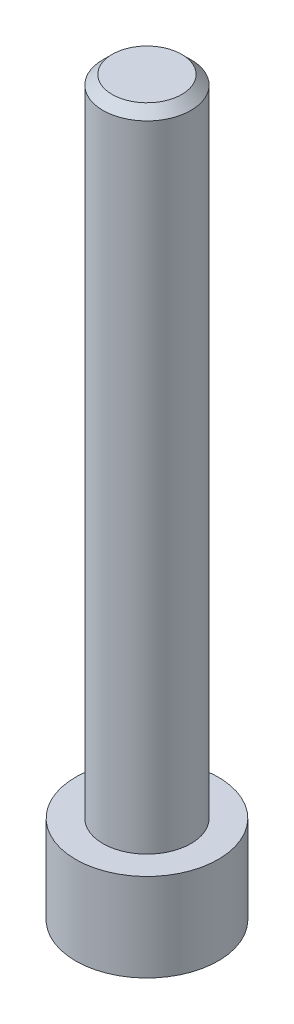
ISO-10303-21;
HEADER;
FILE_DESCRIPTION(('STEP AP214'),'2;1');
FILE_NAME('part.step','',(''),(''),'','','');
FILE_SCHEMA(('AUTOMOTIVE_DESIGN { 1 0 10303 214 1 1 1 1 }'));
ENDSEC;
DATA;
#1=APPLICATION_CONTEXT('core data for automotive mechanical design processes');
#2=APPLICATION_PROTOCOL_DEFINITION('international standard','automotive_design',2000,#1);
#3=PRODUCT_CONTEXT('',#1,'mechanical');
#4=PRODUCT('Part','Part','',(#3));
#5=PRODUCT_RELATED_PRODUCT_CATEGORY('part','',(#4));
#6=PRODUCT_DEFINITION_FORMATION('','',#4);
#7=PRODUCT_DEFINITION_CONTEXT('part definition',#1,'design');
#8=PRODUCT_DEFINITION('design','',#6,#7);
#9=PRODUCT_DEFINITION_SHAPE('','',#8);
#10=(LENGTH_UNIT() NAMED_UNIT(*) SI_UNIT(.MILLI.,.METRE.));
#11=(NAMED_UNIT(*) PLANE_ANGLE_UNIT() SI_UNIT($,.RADIAN.));
#12=(NAMED_UNIT(*) SI_UNIT($,.STERADIAN.) SOLID_ANGLE_UNIT());
#13=UNCERTAINTY_MEASURE_WITH_UNIT(LENGTH_MEASURE(1.E-05),#10,'distance_accuracy_value','');
#14=(GEOMETRIC_REPRESENTATION_CONTEXT(3) GLOBAL_UNCERTAINTY_ASSIGNED_CONTEXT((#13)) GLOBAL_UNIT_ASSIGNED_CONTEXT((#10,
#11,#12)) REPRESENTATION_CONTEXT('',''));
#15=CARTESIAN_POINT('',(0.,0.,0.));
#16=DIRECTION('',(0.,0.,1.));
#17=DIRECTION('',(1.,0.,0.));
#18=AXIS2_PLACEMENT_3D('',#15,#16,#17);
#19=CARTESIAN_POINT('',(0.,39.78,0.));
#20=DIRECTION('',(0.,-1.,0.));
#21=DIRECTION('',(0.,0.,-1.));
#22=AXIS2_PLACEMENT_3D('',#19,#20,#21);
#23=CYLINDRICAL_SURFACE('',#22,3.875);
#24=CARTESIAN_POINT('',(0.,0.,0.));
#25=DIRECTION('',(0.,1.,0.));
#26=DIRECTION('',(0.,0.,1.));
#27=AXIS2_PLACEMENT_3D('',#24,#25,#26);
#28=CIRCLE('',#27,3.875);
#29=CARTESIAN_POINT('',(0.,0.,3.875));
#30=VERTEX_POINT('',#29);
#31=EDGE_CURVE('E151',#30,#30,#28,.T.);
#32=ORIENTED_EDGE('',*,*,#31,.T.);
#33=EDGE_LOOP('',(#32));
#34=FACE_BOUND('',#33,.T.);
#35=CARTESIAN_POINT('',(0.,4.78,0.));
#36=DIRECTION('',(0.,1.,0.));
#37=DIRECTION('',(0.,0.,1.));
#38=AXIS2_PLACEMENT_3D('',#35,#36,#37);
#39=CIRCLE('',#38,3.875);
#40=CARTESIAN_POINT('',(0.,4.78,3.875));
#41=VERTEX_POINT('',#40);
#42=EDGE_CURVE('E150',#41,#41,#39,.T.);
#43=ORIENTED_EDGE('',*,*,#42,.F.);
#44=EDGE_LOOP('',(#43));
#45=FACE_BOUND('',#44,.T.);
#46=ADVANCED_FACE('F40',(#34,#45),#23,.T.);
#47=CARTESIAN_POINT('',(0.,0.,0.));
#48=DIRECTION('',(0.,1.,0.));
#49=DIRECTION('',(0.,0.,1.));
#50=AXIS2_PLACEMENT_3D('',#47,#48,#49);
#51=PLANE('',#50);
#52=DIRECTION('',(-0.5,0.,0.866025403784439));
#53=VECTOR('',#52,1.);
#54=CARTESIAN_POINT('',(2.64426423288849,0.,0.));
#55=LINE('',#54,#53);
#56=CARTESIAN_POINT('',(2.64426423288849,0.,0.));
#57=VERTEX_POINT('',#56);
#58=CARTESIAN_POINT('',(1.32213211644424,0.,2.29));
#59=VERTEX_POINT('',#58);
#60=EDGE_CURVE('E129',#57,#59,#55,.T.);
#61=ORIENTED_EDGE('',*,*,#60,.F.);
#62=DIRECTION('',(0.5,0.,0.866025403784439));
#63=VECTOR('',#62,1.);
#64=CARTESIAN_POINT('',(1.32213211644424,0.,-2.29));
#65=LINE('',#64,#63);
#66=CARTESIAN_POINT('',(1.32213211644424,0.,-2.29));
#67=VERTEX_POINT('',#66);
#68=EDGE_CURVE('E55',#67,#57,#65,.T.);
#69=ORIENTED_EDGE('',*,*,#68,.F.);
#70=DIRECTION('',(1.,0.,0.));
#71=VECTOR('',#70,1.);
#72=CARTESIAN_POINT('',(-1.32213211644424,0.,-2.29));
#73=LINE('',#72,#71);
#74=CARTESIAN_POINT('',(-1.32213211644424,0.,-2.29));
#75=VERTEX_POINT('',#74);
#76=EDGE_CURVE('E138',#75,#67,#73,.T.);
#77=ORIENTED_EDGE('',*,*,#76,.F.);
#78=DIRECTION('',(0.5,0.,-0.866025403784439));
#79=VECTOR('',#78,1.);
#80=CARTESIAN_POINT('',(-2.64426423288849,0.,0.));
#81=LINE('',#80,#79);
#82=CARTESIAN_POINT('',(-2.64426423288849,0.,0.));
#83=VERTEX_POINT('',#82);
#84=EDGE_CURVE('E136',#83,#75,#81,.T.);
#85=ORIENTED_EDGE('',*,*,#84,.F.);
#86=DIRECTION('',(-0.5,0.,-0.866025403784439));
#87=VECTOR('',#86,1.);
#88=CARTESIAN_POINT('',(-1.32213211644424,0.,2.29));
#89=LINE('',#88,#87);
#90=CARTESIAN_POINT('',(-1.32213211644424,0.,2.29));
#91=VERTEX_POINT('',#90);
#92=EDGE_CURVE('E103',#91,#83,#89,.T.);
#93=ORIENTED_EDGE('',*,*,#92,.F.);
#94=DIRECTION('',(-1.,0.,0.));
#95=VECTOR('',#94,1.);
#96=CARTESIAN_POINT('',(1.32213211644424,0.,2.29));
#97=LINE('',#96,#95);
#98=EDGE_CURVE('E132',#59,#91,#97,.T.);
#99=ORIENTED_EDGE('',*,*,#98,.F.);
#100=EDGE_LOOP('',(#61,#69,#77,#85,#93,#99));
#101=FACE_BOUND('',#100,.T.);
#102=ORIENTED_EDGE('',*,*,#31,.F.);
#103=EDGE_LOOP('',(#102));
#104=FACE_BOUND('',#103,.T.);
#105=ADVANCED_FACE('F173',(#101,#104),#51,.F.);
#106=CARTESIAN_POINT('',(0.,4.78,0.));
#107=DIRECTION('',(0.,1.,0.));
#108=DIRECTION('',(0.,0.,1.));
#109=AXIS2_PLACEMENT_3D('',#106,#107,#108);
#110=PLANE('',#109);
#111=CARTESIAN_POINT('',(0.,4.78,0.));
#112=DIRECTION('',(0.,1.,0.));
#113=DIRECTION('',(0.,0.,1.));
#114=AXIS2_PLACEMENT_3D('',#111,#112,#113);
#115=CIRCLE('',#114,2.39);
#116=CARTESIAN_POINT('',(0.,4.78,2.39));
#117=VERTEX_POINT('',#116);
#118=EDGE_CURVE('E142',#117,#117,#115,.T.);
#119=ORIENTED_EDGE('',*,*,#118,.F.);
#120=EDGE_LOOP('',(#119));
#121=FACE_BOUND('',#120,.T.);
#122=ORIENTED_EDGE('',*,*,#42,.T.);
#123=EDGE_LOOP('',(#122));
#124=FACE_BOUND('',#123,.T.);
#125=ADVANCED_FACE('F178',(#121,#124),#110,.T.);
#126=CARTESIAN_POINT('',(0.,4.78,0.));
#127=DIRECTION('',(0.,1.,0.));
#128=DIRECTION('',(0.,0.,1.));
#129=AXIS2_PLACEMENT_3D('',#126,#127,#128);
#130=CYLINDRICAL_SURFACE('',#129,2.39);
#131=CARTESIAN_POINT('',(0.,39.28,0.));
#132=DIRECTION('',(0.,1.,0.));
#133=DIRECTION('',(0.,0.,1.));
#134=AXIS2_PLACEMENT_3D('',#131,#132,#133);
#135=CIRCLE('',#134,2.39);
#136=CARTESIAN_POINT('',(0.,39.28,2.39));
#137=VERTEX_POINT('',#136);
#138=EDGE_CURVE('E12',#137,#137,#135,.F.);
#139=ORIENTED_EDGE('',*,*,#138,.T.);
#140=EDGE_LOOP('',(#139));
#141=FACE_BOUND('',#140,.T.);
#142=ORIENTED_EDGE('',*,*,#118,.T.);
#143=EDGE_LOOP('',(#142));
#144=FACE_BOUND('',#143,.T.);
#145=ADVANCED_FACE('F169',(#141,#144),#130,.T.);
#146=CARTESIAN_POINT('',(0.,39.78,0.));
#147=DIRECTION('',(0.,1.,0.));
#148=DIRECTION('',(0.,0.,1.));
#149=AXIS2_PLACEMENT_3D('',#146,#147,#148);
#150=PLANE('',#149);
#151=CARTESIAN_POINT('',(0.,39.78,0.));
#152=DIRECTION('',(0.,1.,0.));
#153=DIRECTION('',(0.,0.,1.));
#154=AXIS2_PLACEMENT_3D('',#151,#152,#153);
#155=CIRCLE('',#154,1.89);
#156=CARTESIAN_POINT('',(0.,39.78,1.89));
#157=VERTEX_POINT('',#156);
#158=EDGE_CURVE('E48',#157,#157,#155,.T.);
#159=ORIENTED_EDGE('',*,*,#158,.T.);
#160=EDGE_LOOP('',(#159));
#161=FACE_BOUND('',#160,.T.);
#162=ADVANCED_FACE('F158',(#161),#150,.T.);
#163=CARTESIAN_POINT('',(0.,39.78,0.));
#164=DIRECTION('',(0.,-1.,0.));
#165=DIRECTION('',(0.,0.,-1.));
#166=AXIS2_PLACEMENT_3D('',#163,#164,#165);
#167=CONICAL_SURFACE('',#166,1.89,0.785398163397452);
#168=ORIENTED_EDGE('',*,*,#138,.F.);
#169=EDGE_LOOP('',(#168));
#170=FACE_BOUND('',#169,.T.);
#171=ORIENTED_EDGE('',*,*,#158,.F.);
#172=EDGE_LOOP('',(#171));
#173=FACE_BOUND('',#172,.T.);
#174=ADVANCED_FACE('F42',(#170,#173),#167,.T.);
#175=CARTESIAN_POINT('',(1.32213211644424,3.36,-2.29));
#176=DIRECTION('',(0.866025403784439,0.,-0.5));
#177=DIRECTION('',(-0.5,0.,-0.866025403784439));
#178=AXIS2_PLACEMENT_3D('',#175,#176,#177);
#179=PLANE('',#178);
#180=ORIENTED_EDGE('',*,*,#68,.T.);
#181=DIRECTION('',(0.,-1.,0.));
#182=VECTOR('',#181,1.);
#183=CARTESIAN_POINT('',(2.64426423288849,3.36,0.));
#184=LINE('',#183,#182);
#185=CARTESIAN_POINT('',(2.64426423288849,3.36,0.));
#186=VERTEX_POINT('',#185);
#187=EDGE_CURVE('E85',#186,#57,#184,.T.);
#188=ORIENTED_EDGE('',*,*,#187,.F.);
#189=DIRECTION('',(0.5,0.,0.866025403784439));
#190=VECTOR('',#189,1.);
#191=CARTESIAN_POINT('',(1.32213211644424,3.36,-2.29));
#192=LINE('',#191,#190);
#193=CARTESIAN_POINT('',(1.32213211644424,3.36,-2.29));
#194=VERTEX_POINT('',#193);
#195=EDGE_CURVE('E140',#194,#186,#192,.T.);
#196=ORIENTED_EDGE('',*,*,#195,.F.);
#197=DIRECTION('',(0.,-1.,0.));
#198=VECTOR('',#197,1.);
#199=CARTESIAN_POINT('',(1.32213211644424,3.36,-2.29));
#200=LINE('',#199,#198);
#201=EDGE_CURVE('E63',#194,#67,#200,.T.);
#202=ORIENTED_EDGE('',*,*,#201,.T.);
#203=EDGE_LOOP('',(#180,#188,#196,#202));
#204=FACE_BOUND('',#203,.T.);
#205=ADVANCED_FACE('F161',(#204),#179,.F.);
#206=CARTESIAN_POINT('',(-1.32213211644424,3.36,-2.29));
#207=DIRECTION('',(0.,0.,-1.));
#208=DIRECTION('',(-1.,0.,0.));
#209=AXIS2_PLACEMENT_3D('',#206,#207,#208);
#210=PLANE('',#209);
#211=ORIENTED_EDGE('',*,*,#76,.T.);
#212=ORIENTED_EDGE('',*,*,#201,.F.);
#213=DIRECTION('',(1.,0.,0.));
#214=VECTOR('',#213,1.);
#215=CARTESIAN_POINT('',(-1.32213211644424,3.36,-2.29));
#216=LINE('',#215,#214);
#217=CARTESIAN_POINT('',(-1.32213211644424,3.36,-2.29));
#218=VERTEX_POINT('',#217);
#219=EDGE_CURVE('E115',#218,#194,#216,.T.);
#220=ORIENTED_EDGE('',*,*,#219,.F.);
#221=DIRECTION('',(0.,-1.,0.));
#222=VECTOR('',#221,1.);
#223=CARTESIAN_POINT('',(-1.32213211644424,3.36,-2.29));
#224=LINE('',#223,#222);
#225=EDGE_CURVE('E107',#218,#75,#224,.T.);
#226=ORIENTED_EDGE('',*,*,#225,.T.);
#227=EDGE_LOOP('',(#211,#212,#220,#226));
#228=FACE_BOUND('',#227,.T.);
#229=ADVANCED_FACE('F167',(#228),#210,.F.);
#230=CARTESIAN_POINT('',(-2.64426423288849,3.36,0.));
#231=DIRECTION('',(-0.866025403784438,0.,-0.5));
#232=DIRECTION('',(-0.5,0.,0.866025403784439));
#233=AXIS2_PLACEMENT_3D('',#230,#231,#232);
#234=PLANE('',#233);
#235=ORIENTED_EDGE('',*,*,#84,.T.);
#236=ORIENTED_EDGE('',*,*,#225,.F.);
#237=DIRECTION('',(0.5,0.,-0.866025403784439));
#238=VECTOR('',#237,1.);
#239=CARTESIAN_POINT('',(-2.64426423288849,3.36,0.));
#240=LINE('',#239,#238);
#241=CARTESIAN_POINT('',(-2.64426423288849,3.36,0.));
#242=VERTEX_POINT('',#241);
#243=EDGE_CURVE('E111',#242,#218,#240,.T.);
#244=ORIENTED_EDGE('',*,*,#243,.F.);
#245=DIRECTION('',(0.,-1.,0.));
#246=VECTOR('',#245,1.);
#247=CARTESIAN_POINT('',(-2.64426423288849,3.36,0.));
#248=LINE('',#247,#246);
#249=EDGE_CURVE('E96',#242,#83,#248,.T.);
#250=ORIENTED_EDGE('',*,*,#249,.T.);
#251=EDGE_LOOP('',(#235,#236,#244,#250));
#252=FACE_BOUND('',#251,.T.);
#253=ADVANCED_FACE('F112',(#252),#234,.F.);
#254=CARTESIAN_POINT('',(-1.32213211644424,3.36,2.29));
#255=DIRECTION('',(-0.866025403784439,0.,0.5));
#256=DIRECTION('',(0.5,0.,0.866025403784439));
#257=AXIS2_PLACEMENT_3D('',#254,#255,#256);
#258=PLANE('',#257);
#259=ORIENTED_EDGE('',*,*,#92,.T.);
#260=ORIENTED_EDGE('',*,*,#249,.F.);
#261=DIRECTION('',(-0.5,0.,-0.866025403784439));
#262=VECTOR('',#261,1.);
#263=CARTESIAN_POINT('',(-1.32213211644424,3.36,2.29));
#264=LINE('',#263,#262);
#265=CARTESIAN_POINT('',(-1.32213211644424,3.36,2.29));
#266=VERTEX_POINT('',#265);
#267=EDGE_CURVE('E100',#266,#242,#264,.T.);
#268=ORIENTED_EDGE('',*,*,#267,.F.);
#269=DIRECTION('',(0.,-1.,0.));
#270=VECTOR('',#269,1.);
#271=CARTESIAN_POINT('',(-1.32213211644424,3.36,2.29));
#272=LINE('',#271,#270);
#273=EDGE_CURVE('E108',#266,#91,#272,.T.);
#274=ORIENTED_EDGE('',*,*,#273,.T.);
#275=EDGE_LOOP('',(#259,#260,#268,#274));
#276=FACE_BOUND('',#275,.T.);
#277=ADVANCED_FACE('F98',(#276),#258,.F.);
#278=CARTESIAN_POINT('',(1.32213211644424,3.36,2.29));
#279=DIRECTION('',(0.,0.,1.));
#280=DIRECTION('',(1.,0.,0.));
#281=AXIS2_PLACEMENT_3D('',#278,#279,#280);
#282=PLANE('',#281);
#283=ORIENTED_EDGE('',*,*,#98,.T.);
#284=ORIENTED_EDGE('',*,*,#273,.F.);
#285=DIRECTION('',(-1.,0.,0.));
#286=VECTOR('',#285,1.);
#287=CARTESIAN_POINT('',(1.32213211644424,3.36,2.29));
#288=LINE('',#287,#286);
#289=CARTESIAN_POINT('',(1.32213211644424,3.36,2.29));
#290=VERTEX_POINT('',#289);
#291=EDGE_CURVE('E121',#290,#266,#288,.T.);
#292=ORIENTED_EDGE('',*,*,#291,.F.);
#293=DIRECTION('',(0.,-1.,0.));
#294=VECTOR('',#293,1.);
#295=CARTESIAN_POINT('',(1.32213211644424,3.36,2.29));
#296=LINE('',#295,#294);
#297=EDGE_CURVE('E145',#290,#59,#296,.T.);
#298=ORIENTED_EDGE('',*,*,#297,.T.);
#299=EDGE_LOOP('',(#283,#284,#292,#298));
#300=FACE_BOUND('',#299,.T.);
#301=ADVANCED_FACE('F192',(#300),#282,.F.);
#302=CARTESIAN_POINT('',(2.64426423288849,3.36,0.));
#303=DIRECTION('',(0.866025403784439,0.,0.5));
#304=DIRECTION('',(0.5,0.,-0.866025403784439));
#305=AXIS2_PLACEMENT_3D('',#302,#303,#304);
#306=PLANE('',#305);
#307=ORIENTED_EDGE('',*,*,#60,.T.);
#308=ORIENTED_EDGE('',*,*,#297,.F.);
#309=DIRECTION('',(-0.5,0.,0.866025403784439));
#310=VECTOR('',#309,1.);
#311=CARTESIAN_POINT('',(2.64426423288849,3.36,0.));
#312=LINE('',#311,#310);
#313=EDGE_CURVE('E123',#186,#290,#312,.T.);
#314=ORIENTED_EDGE('',*,*,#313,.F.);
#315=ORIENTED_EDGE('',*,*,#187,.T.);
#316=EDGE_LOOP('',(#307,#308,#314,#315));
#317=FACE_BOUND('',#316,.T.);
#318=ADVANCED_FACE('F189',(#317),#306,.F.);
#319=CARTESIAN_POINT('',(0.,3.36,0.));
#320=DIRECTION('',(0.,-1.,0.));
#321=DIRECTION('',(0.,0.,-1.));
#322=AXIS2_PLACEMENT_3D('',#319,#320,#321);
#323=PLANE('',#322);
#324=ORIENTED_EDGE('',*,*,#195,.T.);
#325=ORIENTED_EDGE('',*,*,#313,.T.);
#326=ORIENTED_EDGE('',*,*,#291,.T.);
#327=ORIENTED_EDGE('',*,*,#267,.T.);
#328=ORIENTED_EDGE('',*,*,#243,.T.);
#329=ORIENTED_EDGE('',*,*,#219,.T.);
#330=EDGE_LOOP('',(#324,#325,#326,#327,#328,#329));
#331=FACE_BOUND('',#330,.T.);
#332=ADVANCED_FACE('F118',(#331),#323,.T.);
#333=CLOSED_SHELL('',(#46,#105,#125,#145,#162,#174,#205,#229,#253,#277,#301,#318,#332));
#334=MANIFOLD_SOLID_BREP('B2',#333);
#335=ADVANCED_BREP_SHAPE_REPRESENTATION('',(#18,#334),#14);
#336=SHAPE_DEFINITION_REPRESENTATION(#9,#335);
ENDSEC;
END-ISO-10303-21;
